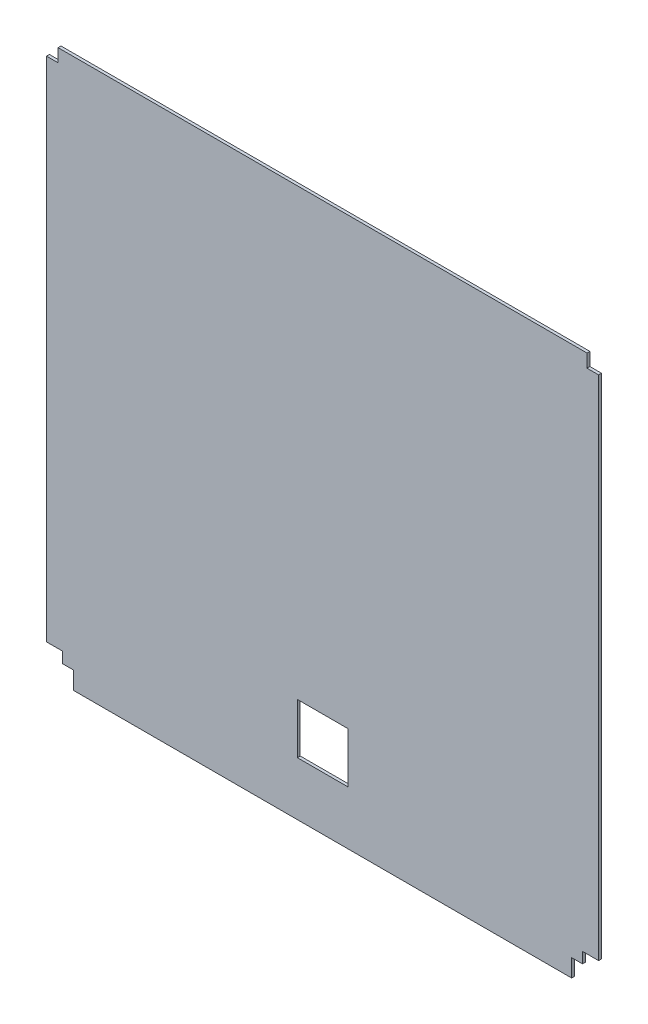
ISO-10303-21;
HEADER;
FILE_DESCRIPTION(('STEP AP214'),'2;1');
FILE_NAME('part.step','',(''),(''),'','','');
FILE_SCHEMA(('AUTOMOTIVE_DESIGN { 1 0 10303 214 1 1 1 1 }'));
ENDSEC;
DATA;
#1=APPLICATION_CONTEXT('core data for automotive mechanical design processes');
#2=APPLICATION_PROTOCOL_DEFINITION('international standard','automotive_design',2000,#1);
#3=PRODUCT_CONTEXT('',#1,'mechanical');
#4=PRODUCT('Part','Part','',(#3));
#5=PRODUCT_RELATED_PRODUCT_CATEGORY('part','',(#4));
#6=PRODUCT_DEFINITION_FORMATION('','',#4);
#7=PRODUCT_DEFINITION_CONTEXT('part definition',#1,'design');
#8=PRODUCT_DEFINITION('design','',#6,#7);
#9=PRODUCT_DEFINITION_SHAPE('','',#8);
#10=(LENGTH_UNIT() NAMED_UNIT(*) SI_UNIT(.MILLI.,.METRE.));
#11=(NAMED_UNIT(*) PLANE_ANGLE_UNIT() SI_UNIT($,.RADIAN.));
#12=(NAMED_UNIT(*) SI_UNIT($,.STERADIAN.) SOLID_ANGLE_UNIT());
#13=UNCERTAINTY_MEASURE_WITH_UNIT(LENGTH_MEASURE(1.E-05),#10,'distance_accuracy_value','');
#14=(GEOMETRIC_REPRESENTATION_CONTEXT(3) GLOBAL_UNCERTAINTY_ASSIGNED_CONTEXT((#13)) GLOBAL_UNIT_ASSIGNED_CONTEXT((#10,
#11,#12)) REPRESENTATION_CONTEXT('',''));
#15=CARTESIAN_POINT('',(0.,0.,0.));
#16=DIRECTION('',(0.,0.,1.));
#17=DIRECTION('',(1.,0.,0.));
#18=AXIS2_PLACEMENT_3D('',#15,#16,#17);
#19=CARTESIAN_POINT('',(0.,0.,0.));
#20=DIRECTION('',(0.,0.,1.));
#21=DIRECTION('',(1.,0.,0.));
#22=AXIS2_PLACEMENT_3D('',#19,#20,#21);
#23=PLANE('',#22);
#24=DIRECTION('',(0.,1.,0.));
#25=VECTOR('',#24,1.);
#26=CARTESIAN_POINT('',(27.8500000000025,-188.0575,0.));
#27=LINE('',#26,#25);
#28=CARTESIAN_POINT('',(27.8500000000025,-243.7575,0.));
#29=VERTEX_POINT('',#28);
#30=CARTESIAN_POINT('',(27.8500000000025,-188.0575,0.));
#31=VERTEX_POINT('',#30);
#32=EDGE_CURVE('E84',#29,#31,#27,.T.);
#33=ORIENTED_EDGE('',*,*,#32,.F.);
#34=DIRECTION('',(1.,0.,0.));
#35=VECTOR('',#34,1.);
#36=CARTESIAN_POINT('',(-27.8500000000025,-243.7575,0.));
#37=LINE('',#36,#35);
#38=CARTESIAN_POINT('',(-27.8500000000025,-243.7575,0.));
#39=VERTEX_POINT('',#38);
#40=EDGE_CURVE('E222',#39,#29,#37,.T.);
#41=ORIENTED_EDGE('',*,*,#40,.F.);
#42=DIRECTION('',(0.,-1.,0.));
#43=VECTOR('',#42,1.);
#44=CARTESIAN_POINT('',(-27.8500000000025,-188.0575,0.));
#45=LINE('',#44,#43);
#46=CARTESIAN_POINT('',(-27.8500000000025,-188.0575,0.));
#47=VERTEX_POINT('',#46);
#48=EDGE_CURVE('E225',#47,#39,#45,.T.);
#49=ORIENTED_EDGE('',*,*,#48,.F.);
#50=DIRECTION('',(-1.,0.,0.));
#51=VECTOR('',#50,1.);
#52=CARTESIAN_POINT('',(-27.8500000000025,-188.0575,0.));
#53=LINE('',#52,#51);
#54=EDGE_CURVE('E231',#31,#47,#53,.T.);
#55=ORIENTED_EDGE('',*,*,#54,.F.);
#56=EDGE_LOOP('',(#33,#41,#49,#55));
#57=FACE_BOUND('',#56,.T.);
#58=DIRECTION('',(1.,0.,0.));
#59=VECTOR('',#58,1.);
#60=CARTESIAN_POINT('',(-304.8,-303.0375,0.));
#61=LINE('',#60,#59);
#62=CARTESIAN_POINT('',(-274.950000000003,-303.0375,0.));
#63=VERTEX_POINT('',#62);
#64=CARTESIAN_POINT('',(274.950000000002,-303.0375,0.));
#65=VERTEX_POINT('',#64);
#66=EDGE_CURVE('E260',#63,#65,#61,.T.);
#67=ORIENTED_EDGE('',*,*,#66,.T.);
#68=DIRECTION('',(0.,1.,0.));
#69=VECTOR('',#68,1.);
#70=CARTESIAN_POINT('',(274.950000000001,9.87971313354263E-13,0.));
#71=LINE('',#70,#69);
#72=CARTESIAN_POINT('',(274.950000000002,-283.537499999998,3.47161535629859E-13));
#73=VERTEX_POINT('',#72);
#74=EDGE_CURVE('E266',#65,#73,#71,.T.);
#75=ORIENTED_EDGE('',*,*,#74,.T.);
#76=DIRECTION('',(-1.,0.,0.));
#77=VECTOR('',#76,1.);
#78=CARTESIAN_POINT('',(286.950000000002,-283.537499999998,3.4629417389187E-13));
#79=LINE('',#78,#77);
#80=CARTESIAN_POINT('',(286.950000000002,-283.537499999998,3.4629417389187E-13));
#81=VERTEX_POINT('',#80);
#82=EDGE_CURVE('E329',#81,#73,#79,.T.);
#83=ORIENTED_EDGE('',*,*,#82,.F.);
#84=DIRECTION('',(0.,1.,0.));
#85=VECTOR('',#84,1.);
#86=CARTESIAN_POINT('',(286.950000000002,-299.003077603944,2.36572914036337E-13));
#87=LINE('',#86,#85);
#88=CARTESIAN_POINT('',(286.950000000002,-271.537499999998,4.31512464649231E-13));
#89=VERTEX_POINT('',#88);
#90=EDGE_CURVE('E264',#81,#89,#87,.T.);
#91=ORIENTED_EDGE('',*,*,#90,.T.);
#92=DIRECTION('',(1.,0.,0.));
#93=VECTOR('',#92,1.);
#94=CARTESIAN_POINT('',(9.75708041920892E-13,-271.537499999999,0.));
#95=LINE('',#94,#93);
#96=CARTESIAN_POINT('',(304.8,-271.537499999998,0.));
#97=VERTEX_POINT('',#96);
#98=EDGE_CURVE('E269',#89,#97,#95,.T.);
#99=ORIENTED_EDGE('',*,*,#98,.T.);
#100=DIRECTION('',(0.,1.,0.));
#101=VECTOR('',#100,1.);
#102=CARTESIAN_POINT('',(304.8,303.0375,0.));
#103=LINE('',#102,#101);
#104=CARTESIAN_POINT('',(304.8,288.537500000004,0.));
#105=VERTEX_POINT('',#104);
#106=EDGE_CURVE('E271',#97,#105,#103,.T.);
#107=ORIENTED_EDGE('',*,*,#106,.T.);
#108=DIRECTION('',(1.,0.,0.));
#109=VECTOR('',#108,1.);
#110=CARTESIAN_POINT('',(2.92281912379367E-13,288.537500000004,0.));
#111=LINE('',#110,#109);
#112=CARTESIAN_POINT('',(291.949999998872,288.537500000004,0.));
#113=VERTEX_POINT('',#112);
#114=EDGE_CURVE('E297',#113,#105,#111,.T.);
#115=ORIENTED_EDGE('',*,*,#114,.F.);
#116=DIRECTION('',(0.,-1.,0.));
#117=VECTOR('',#116,1.);
#118=CARTESIAN_POINT('',(291.949999998872,1.4786934855751E-13,0.));
#119=LINE('',#118,#117);
#120=CARTESIAN_POINT('',(291.949999998872,303.0375,0.));
#121=VERTEX_POINT('',#120);
#122=EDGE_CURVE('E303',#121,#113,#119,.T.);
#123=ORIENTED_EDGE('',*,*,#122,.F.);
#124=DIRECTION('',(-1.,0.,0.));
#125=VECTOR('',#124,1.);
#126=CARTESIAN_POINT('',(-304.8,303.0375,0.));
#127=LINE('',#126,#125);
#128=CARTESIAN_POINT('',(-291.949999998866,303.0375,0.));
#129=VERTEX_POINT('',#128);
#130=EDGE_CURVE('E272',#121,#129,#127,.T.);
#131=ORIENTED_EDGE('',*,*,#130,.T.);
#132=DIRECTION('',(0.,1.,0.));
#133=VECTOR('',#132,1.);
#134=CARTESIAN_POINT('',(-291.949999998866,2.95738697115014E-13,0.));
#135=LINE('',#134,#133);
#136=CARTESIAN_POINT('',(-291.949999998866,288.537499997875,0.));
#137=VERTEX_POINT('',#136);
#138=EDGE_CURVE('E283',#137,#129,#135,.T.);
#139=ORIENTED_EDGE('',*,*,#138,.F.);
#140=DIRECTION('',(1.,0.,0.));
#141=VECTOR('',#140,1.);
#142=CARTESIAN_POINT('',(0.,288.537499997875,0.));
#143=LINE('',#142,#141);
#144=CARTESIAN_POINT('',(-304.8,288.537499997875,0.));
#145=VERTEX_POINT('',#144);
#146=EDGE_CURVE('E290',#145,#137,#143,.T.);
#147=ORIENTED_EDGE('',*,*,#146,.F.);
#148=DIRECTION('',(0.,-1.,0.));
#149=VECTOR('',#148,1.);
#150=CARTESIAN_POINT('',(-304.8,303.0375,0.));
#151=LINE('',#150,#149);
#152=CARTESIAN_POINT('',(-304.8,-271.5375,0.));
#153=VERTEX_POINT('',#152);
#154=EDGE_CURVE('E265',#145,#153,#151,.T.);
#155=ORIENTED_EDGE('',*,*,#154,.T.);
#156=DIRECTION('',(1.,0.,0.));
#157=VECTOR('',#156,1.);
#158=CARTESIAN_POINT('',(0.,-271.5375,0.));
#159=LINE('',#158,#157);
#160=CARTESIAN_POINT('',(-286.950000000003,-271.5375,-1.196959198424E-13));
#161=VERTEX_POINT('',#160);
#162=EDGE_CURVE('E261',#153,#161,#159,.T.);
#163=ORIENTED_EDGE('',*,*,#162,.T.);
#164=DIRECTION('',(0.,1.,0.));
#165=VECTOR('',#164,1.);
#166=CARTESIAN_POINT('',(-286.950000000003,-299.003077603946,-1.196959198424E-13));
#167=LINE('',#166,#165);
#168=CARTESIAN_POINT('',(-286.950000000003,-283.5375,-1.196959198424E-13));
#169=VERTEX_POINT('',#168);
#170=EDGE_CURVE('E316',#169,#161,#167,.T.);
#171=ORIENTED_EDGE('',*,*,#170,.F.);
#172=DIRECTION('',(-1.,0.,0.));
#173=VECTOR('',#172,1.);
#174=CARTESIAN_POINT('',(-286.950000000003,-283.5375,-1.196959198424E-13));
#175=LINE('',#174,#173);
#176=CARTESIAN_POINT('',(-274.950000000003,-283.5375,-1.196959198424E-13));
#177=VERTEX_POINT('',#176);
#178=EDGE_CURVE('E344',#177,#169,#175,.T.);
#179=ORIENTED_EDGE('',*,*,#178,.F.);
#180=DIRECTION('',(0.,-1.,0.));
#181=VECTOR('',#180,1.);
#182=CARTESIAN_POINT('',(-274.950000000003,0.,0.));
#183=LINE('',#182,#181);
#184=EDGE_CURVE('E244',#177,#63,#183,.T.);
#185=ORIENTED_EDGE('',*,*,#184,.T.);
#186=EDGE_LOOP('',(#67,#75,#83,#91,#99,#107,#115,#123,#131,#139,#147,#155,#163,#171,#179,#185));
#187=FACE_BOUND('',#186,.T.);
#188=ADVANCED_FACE('F67',(#57,#187),#23,.T.);
#189=CARTESIAN_POINT('',(304.8,303.0375,-3.175));
#190=DIRECTION('',(1.,0.,0.));
#191=DIRECTION('',(0.,1.,0.));
#192=AXIS2_PLACEMENT_3D('',#189,#190,#191);
#193=PLANE('',#192);
#194=ORIENTED_EDGE('',*,*,#106,.F.);
#195=DIRECTION('',(0.,0.,1.));
#196=VECTOR('',#195,1.);
#197=CARTESIAN_POINT('',(304.8,-271.537499999998,-3.175));
#198=LINE('',#197,#196);
#199=CARTESIAN_POINT('',(304.8,-271.537499999998,-3.175));
#200=VERTEX_POINT('',#199);
#201=EDGE_CURVE('E245',#200,#97,#198,.T.);
#202=ORIENTED_EDGE('',*,*,#201,.F.);
#203=DIRECTION('',(0.,1.,0.));
#204=VECTOR('',#203,1.);
#205=CARTESIAN_POINT('',(304.8,303.0375,-3.175));
#206=LINE('',#205,#204);
#207=CARTESIAN_POINT('',(304.8,288.537500000004,-3.175));
#208=VERTEX_POINT('',#207);
#209=EDGE_CURVE('E333',#200,#208,#206,.T.);
#210=ORIENTED_EDGE('',*,*,#209,.T.);
#211=DIRECTION('',(0.,0.,-1.));
#212=VECTOR('',#211,1.);
#213=CARTESIAN_POINT('',(304.8,288.537500000004,-3.175));
#214=LINE('',#213,#212);
#215=EDGE_CURVE('E293',#105,#208,#214,.T.);
#216=ORIENTED_EDGE('',*,*,#215,.F.);
#217=EDGE_LOOP('',(#194,#202,#210,#216));
#218=FACE_BOUND('',#217,.T.);
#219=ADVANCED_FACE('F414',(#218),#193,.T.);
#220=CARTESIAN_POINT('',(0.,0.,-3.175));
#221=DIRECTION('',(0.,0.,1.));
#222=DIRECTION('',(1.,0.,0.));
#223=AXIS2_PLACEMENT_3D('',#220,#221,#222);
#224=PLANE('',#223);
#225=DIRECTION('',(1.,0.,0.));
#226=VECTOR('',#225,1.);
#227=CARTESIAN_POINT('',(-27.8500000000025,-243.7575,-3.175));
#228=LINE('',#227,#226);
#229=CARTESIAN_POINT('',(-27.8500000000025,-243.7575,-3.175));
#230=VERTEX_POINT('',#229);
#231=CARTESIAN_POINT('',(27.8500000000025,-243.7575,-3.175));
#232=VERTEX_POINT('',#231);
#233=EDGE_CURVE('E213',#230,#232,#228,.T.);
#234=ORIENTED_EDGE('',*,*,#233,.T.);
#235=DIRECTION('',(0.,1.,0.));
#236=VECTOR('',#235,1.);
#237=CARTESIAN_POINT('',(27.8500000000025,-188.0575,-3.175));
#238=LINE('',#237,#236);
#239=CARTESIAN_POINT('',(27.8500000000025,-188.0575,-3.175));
#240=VERTEX_POINT('',#239);
#241=EDGE_CURVE('E207',#232,#240,#238,.T.);
#242=ORIENTED_EDGE('',*,*,#241,.T.);
#243=DIRECTION('',(-1.,0.,0.));
#244=VECTOR('',#243,1.);
#245=CARTESIAN_POINT('',(-27.8500000000025,-188.0575,-3.175));
#246=LINE('',#245,#244);
#247=CARTESIAN_POINT('',(-27.8500000000025,-188.0575,-3.175));
#248=VERTEX_POINT('',#247);
#249=EDGE_CURVE('E216',#240,#248,#246,.T.);
#250=ORIENTED_EDGE('',*,*,#249,.T.);
#251=DIRECTION('',(0.,-1.,0.));
#252=VECTOR('',#251,1.);
#253=CARTESIAN_POINT('',(-27.8500000000025,-188.0575,-3.175));
#254=LINE('',#253,#252);
#255=EDGE_CURVE('E92',#248,#230,#254,.T.);
#256=ORIENTED_EDGE('',*,*,#255,.T.);
#257=EDGE_LOOP('',(#234,#242,#250,#256));
#258=FACE_BOUND('',#257,.T.);
#259=DIRECTION('',(0.,1.,0.));
#260=VECTOR('',#259,1.);
#261=CARTESIAN_POINT('',(274.950000000001,9.87971313354263E-13,-3.175));
#262=LINE('',#261,#260);
#263=CARTESIAN_POINT('',(274.950000000002,-303.0375,-3.175));
#264=VERTEX_POINT('',#263);
#265=CARTESIAN_POINT('',(274.950000000002,-283.537499999998,-3.175));
#266=VERTEX_POINT('',#265);
#267=EDGE_CURVE('E12',#264,#266,#262,.T.);
#268=ORIENTED_EDGE('',*,*,#267,.F.);
#269=DIRECTION('',(1.,0.,0.));
#270=VECTOR('',#269,1.);
#271=CARTESIAN_POINT('',(-304.8,-303.0375,-3.175));
#272=LINE('',#271,#270);
#273=CARTESIAN_POINT('',(-274.950000000003,-303.0375,-3.175));
#274=VERTEX_POINT('',#273);
#275=EDGE_CURVE('E279',#274,#264,#272,.T.);
#276=ORIENTED_EDGE('',*,*,#275,.F.);
#277=DIRECTION('',(0.,-1.,0.));
#278=VECTOR('',#277,1.);
#279=CARTESIAN_POINT('',(-274.950000000003,0.,-3.175));
#280=LINE('',#279,#278);
#281=CARTESIAN_POINT('',(-274.950000000003,-283.5375,-3.175));
#282=VERTEX_POINT('',#281);
#283=EDGE_CURVE('E310',#282,#274,#280,.T.);
#284=ORIENTED_EDGE('',*,*,#283,.F.);
#285=DIRECTION('',(-1.,0.,0.));
#286=VECTOR('',#285,1.);
#287=CARTESIAN_POINT('',(0.,-283.5375,-3.175));
#288=LINE('',#287,#286);
#289=CARTESIAN_POINT('',(-286.950000000003,-283.5375,-3.175));
#290=VERTEX_POINT('',#289);
#291=EDGE_CURVE('E292',#282,#290,#288,.T.);
#292=ORIENTED_EDGE('',*,*,#291,.T.);
#293=DIRECTION('',(0.,-1.,0.));
#294=VECTOR('',#293,1.);
#295=CARTESIAN_POINT('',(-286.950000000003,0.,-3.175));
#296=LINE('',#295,#294);
#297=CARTESIAN_POINT('',(-286.950000000003,-271.5375,-3.175));
#298=VERTEX_POINT('',#297);
#299=EDGE_CURVE('E317',#298,#290,#296,.T.);
#300=ORIENTED_EDGE('',*,*,#299,.F.);
#301=DIRECTION('',(1.,0.,0.));
#302=VECTOR('',#301,1.);
#303=CARTESIAN_POINT('',(0.,-271.5375,-3.175));
#304=LINE('',#303,#302);
#305=CARTESIAN_POINT('',(-304.8,-271.5375,-3.175));
#306=VERTEX_POINT('',#305);
#307=EDGE_CURVE('E314',#306,#298,#304,.T.);
#308=ORIENTED_EDGE('',*,*,#307,.F.);
#309=DIRECTION('',(0.,-1.,0.));
#310=VECTOR('',#309,1.);
#311=CARTESIAN_POINT('',(-304.8,303.0375,-3.175));
#312=LINE('',#311,#310);
#313=CARTESIAN_POINT('',(-304.8,288.537499997875,-3.175));
#314=VERTEX_POINT('',#313);
#315=EDGE_CURVE('E71',#314,#306,#312,.T.);
#316=ORIENTED_EDGE('',*,*,#315,.F.);
#317=DIRECTION('',(1.,0.,0.));
#318=VECTOR('',#317,1.);
#319=CARTESIAN_POINT('',(0.,288.537499997875,-3.175));
#320=LINE('',#319,#318);
#321=CARTESIAN_POINT('',(-291.949999998866,288.537499997875,-3.175));
#322=VERTEX_POINT('',#321);
#323=EDGE_CURVE('E288',#314,#322,#320,.T.);
#324=ORIENTED_EDGE('',*,*,#323,.T.);
#325=DIRECTION('',(0.,1.,0.));
#326=VECTOR('',#325,1.);
#327=CARTESIAN_POINT('',(-291.949999998866,2.95738697115014E-13,-3.175));
#328=LINE('',#327,#326);
#329=CARTESIAN_POINT('',(-291.949999998866,303.0375,-3.175));
#330=VERTEX_POINT('',#329);
#331=EDGE_CURVE('E284',#322,#330,#328,.T.);
#332=ORIENTED_EDGE('',*,*,#331,.T.);
#333=DIRECTION('',(-1.,0.,0.));
#334=VECTOR('',#333,1.);
#335=CARTESIAN_POINT('',(-304.8,303.0375,-3.175));
#336=LINE('',#335,#334);
#337=CARTESIAN_POINT('',(291.949999998872,303.0375,-3.175));
#338=VERTEX_POINT('',#337);
#339=EDGE_CURVE('E275',#338,#330,#336,.T.);
#340=ORIENTED_EDGE('',*,*,#339,.F.);
#341=DIRECTION('',(0.,-1.,0.));
#342=VECTOR('',#341,1.);
#343=CARTESIAN_POINT('',(291.949999998872,1.4786934855751E-13,-3.175));
#344=LINE('',#343,#342);
#345=CARTESIAN_POINT('',(291.949999998872,288.537500000004,-3.175));
#346=VERTEX_POINT('',#345);
#347=EDGE_CURVE('E287',#338,#346,#344,.T.);
#348=ORIENTED_EDGE('',*,*,#347,.T.);
#349=DIRECTION('',(1.,0.,0.));
#350=VECTOR('',#349,1.);
#351=CARTESIAN_POINT('',(2.92281912379367E-13,288.537500000004,-3.175));
#352=LINE('',#351,#350);
#353=EDGE_CURVE('E298',#346,#208,#352,.T.);
#354=ORIENTED_EDGE('',*,*,#353,.T.);
#355=ORIENTED_EDGE('',*,*,#209,.F.);
#356=DIRECTION('',(1.,0.,0.));
#357=VECTOR('',#356,1.);
#358=CARTESIAN_POINT('',(9.75708041920892E-13,-271.537499999999,-3.175));
#359=LINE('',#358,#357);
#360=CARTESIAN_POINT('',(286.950000000002,-271.537499999998,-3.175));
#361=VERTEX_POINT('',#360);
#362=EDGE_CURVE('E322',#361,#200,#359,.T.);
#363=ORIENTED_EDGE('',*,*,#362,.F.);
#364=DIRECTION('',(0.,1.,0.));
#365=VECTOR('',#364,1.);
#366=CARTESIAN_POINT('',(286.950000000001,1.03109062872161E-12,-3.175));
#367=LINE('',#366,#365);
#368=CARTESIAN_POINT('',(286.950000000002,-283.537499999998,-3.175));
#369=VERTEX_POINT('',#368);
#370=EDGE_CURVE('E324',#369,#361,#367,.T.);
#371=ORIENTED_EDGE('',*,*,#370,.F.);
#372=DIRECTION('',(-1.,0.,0.));
#373=VECTOR('',#372,1.);
#374=CARTESIAN_POINT('',(1.01882730354424E-12,-283.537499999999,-3.175));
#375=LINE('',#374,#373);
#376=EDGE_CURVE('E301',#369,#266,#375,.T.);
#377=ORIENTED_EDGE('',*,*,#376,.T.);
#378=EDGE_LOOP('',(#268,#276,#284,#292,#300,#308,#316,#324,#332,#340,#348,#354,#355,#363,#371,#377));
#379=FACE_BOUND('',#378,.T.);
#380=ADVANCED_FACE('F69',(#258,#379),#224,.F.);
#381=CARTESIAN_POINT('',(-304.8,-303.0375,-3.175));
#382=DIRECTION('',(0.,-1.,0.));
#383=DIRECTION('',(0.,0.,-1.));
#384=AXIS2_PLACEMENT_3D('',#381,#382,#383);
#385=PLANE('',#384);
#386=DIRECTION('',(0.,0.,1.));
#387=VECTOR('',#386,1.);
#388=CARTESIAN_POINT('',(274.950000000002,-303.0375,-3.175));
#389=LINE('',#388,#387);
#390=EDGE_CURVE('E241',#264,#65,#389,.T.);
#391=ORIENTED_EDGE('',*,*,#390,.T.);
#392=ORIENTED_EDGE('',*,*,#66,.F.);
#393=DIRECTION('',(0.,0.,1.));
#394=VECTOR('',#393,1.);
#395=CARTESIAN_POINT('',(-274.950000000003,-303.0375,-3.175));
#396=LINE('',#395,#394);
#397=EDGE_CURVE('E254',#274,#63,#396,.T.);
#398=ORIENTED_EDGE('',*,*,#397,.F.);
#399=ORIENTED_EDGE('',*,*,#275,.T.);
#400=EDGE_LOOP('',(#391,#392,#398,#399));
#401=FACE_BOUND('',#400,.T.);
#402=ADVANCED_FACE('F357',(#401),#385,.T.);
#403=CARTESIAN_POINT('',(-304.8,303.0375,-3.175));
#404=DIRECTION('',(-1.,0.,0.));
#405=DIRECTION('',(0.,-1.,0.));
#406=AXIS2_PLACEMENT_3D('',#403,#404,#405);
#407=PLANE('',#406);
#408=DIRECTION('',(0.,0.,1.));
#409=VECTOR('',#408,1.);
#410=CARTESIAN_POINT('',(-304.8,-271.5375,-3.175));
#411=LINE('',#410,#409);
#412=EDGE_CURVE('E237',#306,#153,#411,.T.);
#413=ORIENTED_EDGE('',*,*,#412,.T.);
#414=ORIENTED_EDGE('',*,*,#154,.F.);
#415=DIRECTION('',(0.,0.,1.));
#416=VECTOR('',#415,1.);
#417=CARTESIAN_POINT('',(-304.8,288.537499997875,-3.175));
#418=LINE('',#417,#416);
#419=EDGE_CURVE('E278',#314,#145,#418,.T.);
#420=ORIENTED_EDGE('',*,*,#419,.F.);
#421=ORIENTED_EDGE('',*,*,#315,.T.);
#422=EDGE_LOOP('',(#413,#414,#420,#421));
#423=FACE_BOUND('',#422,.T.);
#424=ADVANCED_FACE('F387',(#423),#407,.T.);
#425=CARTESIAN_POINT('',(-304.8,303.0375,-3.175));
#426=DIRECTION('',(0.,1.,0.));
#427=DIRECTION('',(0.,0.,1.));
#428=AXIS2_PLACEMENT_3D('',#425,#426,#427);
#429=PLANE('',#428);
#430=DIRECTION('',(0.,0.,1.));
#431=VECTOR('',#430,1.);
#432=CARTESIAN_POINT('',(291.949999998872,303.0375,-3.175));
#433=LINE('',#432,#431);
#434=EDGE_CURVE('E282',#338,#121,#433,.T.);
#435=ORIENTED_EDGE('',*,*,#434,.F.);
#436=ORIENTED_EDGE('',*,*,#339,.T.);
#437=DIRECTION('',(0.,0.,-1.));
#438=VECTOR('',#437,1.);
#439=CARTESIAN_POINT('',(-291.949999998866,303.0375,-3.175));
#440=LINE('',#439,#438);
#441=EDGE_CURVE('E280',#129,#330,#440,.T.);
#442=ORIENTED_EDGE('',*,*,#441,.F.);
#443=ORIENTED_EDGE('',*,*,#130,.F.);
#444=EDGE_LOOP('',(#435,#436,#442,#443));
#445=FACE_BOUND('',#444,.T.);
#446=ADVANCED_FACE('F402',(#445),#429,.T.);
#447=CARTESIAN_POINT('',(-314.449999998866,288.537499997875,279.050000066034));
#448=DIRECTION('',(0.,-1.,0.));
#449=DIRECTION('',(1.,0.,0.));
#450=AXIS2_PLACEMENT_3D('',#447,#448,#449);
#451=PLANE('',#450);
#452=ORIENTED_EDGE('',*,*,#419,.T.);
#453=ORIENTED_EDGE('',*,*,#146,.T.);
#454=DIRECTION('',(0.,0.,1.));
#455=VECTOR('',#454,1.);
#456=CARTESIAN_POINT('',(-291.949999998866,288.537499997875,-3.175));
#457=LINE('',#456,#455);
#458=EDGE_CURVE('E251',#322,#137,#457,.T.);
#459=ORIENTED_EDGE('',*,*,#458,.F.);
#460=ORIENTED_EDGE('',*,*,#323,.F.);
#461=EDGE_LOOP('',(#452,#453,#459,#460));
#462=FACE_BOUND('',#461,.T.);
#463=ADVANCED_FACE('F395',(#462),#451,.F.);
#464=CARTESIAN_POINT('',(-291.949999998866,311.037499997875,279.050000066034));
#465=DIRECTION('',(1.,0.,0.));
#466=DIRECTION('',(0.,1.,0.));
#467=AXIS2_PLACEMENT_3D('',#464,#465,#466);
#468=PLANE('',#467);
#469=ORIENTED_EDGE('',*,*,#331,.F.);
#470=ORIENTED_EDGE('',*,*,#458,.T.);
#471=ORIENTED_EDGE('',*,*,#138,.T.);
#472=ORIENTED_EDGE('',*,*,#441,.T.);
#473=EDGE_LOOP('',(#469,#470,#471,#472));
#474=FACE_BOUND('',#473,.T.);
#475=ADVANCED_FACE('F393',(#474),#468,.F.);
#476=CARTESIAN_POINT('',(291.949999998872,311.037500000004,279.050000066034));
#477=DIRECTION('',(-1.,0.,0.));
#478=DIRECTION('',(0.,-1.,0.));
#479=AXIS2_PLACEMENT_3D('',#476,#477,#478);
#480=PLANE('',#479);
#481=ORIENTED_EDGE('',*,*,#434,.T.);
#482=ORIENTED_EDGE('',*,*,#122,.T.);
#483=DIRECTION('',(0.,0.,1.));
#484=VECTOR('',#483,1.);
#485=CARTESIAN_POINT('',(291.949999998872,288.537500000004,-3.175));
#486=LINE('',#485,#484);
#487=EDGE_CURVE('E248',#346,#113,#486,.T.);
#488=ORIENTED_EDGE('',*,*,#487,.F.);
#489=ORIENTED_EDGE('',*,*,#347,.F.);
#490=EDGE_LOOP('',(#481,#482,#488,#489));
#491=FACE_BOUND('',#490,.T.);
#492=ADVANCED_FACE('F410',(#491),#480,.F.);
#493=CARTESIAN_POINT('',(314.449999998872,288.537500000004,279.050000066034));
#494=DIRECTION('',(0.,-1.,0.));
#495=DIRECTION('',(1.,0.,0.));
#496=AXIS2_PLACEMENT_3D('',#493,#494,#495);
#497=PLANE('',#496);
#498=ORIENTED_EDGE('',*,*,#353,.F.);
#499=ORIENTED_EDGE('',*,*,#487,.T.);
#500=ORIENTED_EDGE('',*,*,#114,.T.);
#501=ORIENTED_EDGE('',*,*,#215,.T.);
#502=EDGE_LOOP('',(#498,#499,#500,#501));
#503=FACE_BOUND('',#502,.T.);
#504=ADVANCED_FACE('F408',(#503),#497,.F.);
#505=CARTESIAN_POINT('',(-289.950000000003,-283.5375,3.31249999999988));
#506=DIRECTION('',(0.,1.,0.));
#507=DIRECTION('',(0.,0.,1.));
#508=AXIS2_PLACEMENT_3D('',#505,#506,#507);
#509=PLANE('',#508);
#510=DIRECTION('',(0.,0.,1.));
#511=VECTOR('',#510,1.);
#512=CARTESIAN_POINT('',(-274.950000000003,-283.5375,-1.196959198424E-13));
#513=LINE('',#512,#511);
#514=EDGE_CURVE('E296',#282,#177,#513,.T.);
#515=ORIENTED_EDGE('',*,*,#514,.T.);
#516=ORIENTED_EDGE('',*,*,#178,.T.);
#517=DIRECTION('',(0.,0.,-1.));
#518=VECTOR('',#517,1.);
#519=CARTESIAN_POINT('',(-286.950000000003,-283.5375,-1.196959198424E-13));
#520=LINE('',#519,#518);
#521=EDGE_CURVE('E319',#169,#290,#520,.T.);
#522=ORIENTED_EDGE('',*,*,#521,.T.);
#523=ORIENTED_EDGE('',*,*,#291,.F.);
#524=EDGE_LOOP('',(#515,#516,#522,#523));
#525=FACE_BOUND('',#524,.T.);
#526=ADVANCED_FACE('F373',(#525),#509,.F.);
#527=CARTESIAN_POINT('',(-286.950000000003,-299.003077603946,-1.196959198424E-13));
#528=DIRECTION('',(-1.,0.,0.));
#529=DIRECTION('',(0.,0.,1.));
#530=AXIS2_PLACEMENT_3D('',#527,#528,#529);
#531=PLANE('',#530);
#532=ORIENTED_EDGE('',*,*,#299,.T.);
#533=ORIENTED_EDGE('',*,*,#521,.F.);
#534=ORIENTED_EDGE('',*,*,#170,.T.);
#535=DIRECTION('',(0.,0.,1.));
#536=VECTOR('',#535,1.);
#537=CARTESIAN_POINT('',(-286.950000000003,-271.5375,-1.196959198424E-13));
#538=LINE('',#537,#536);
#539=EDGE_CURVE('E313',#298,#161,#538,.T.);
#540=ORIENTED_EDGE('',*,*,#539,.F.);
#541=EDGE_LOOP('',(#532,#533,#534,#540));
#542=FACE_BOUND('',#541,.T.);
#543=ADVANCED_FACE('F380',(#542),#531,.T.);
#544=CARTESIAN_POINT('',(-289.950000000003,-271.5375,3.31249999999988));
#545=DIRECTION('',(0.,-1.,0.));
#546=DIRECTION('',(0.,0.,-1.));
#547=AXIS2_PLACEMENT_3D('',#544,#545,#546);
#548=PLANE('',#547);
#549=ORIENTED_EDGE('',*,*,#307,.T.);
#550=ORIENTED_EDGE('',*,*,#539,.T.);
#551=ORIENTED_EDGE('',*,*,#162,.F.);
#552=ORIENTED_EDGE('',*,*,#412,.F.);
#553=EDGE_LOOP('',(#549,#550,#551,#552));
#554=FACE_BOUND('',#553,.T.);
#555=ADVANCED_FACE('F382',(#554),#548,.T.);
#556=CARTESIAN_POINT('',(-274.950000000003,-286.5375,3.31249999999988));
#557=DIRECTION('',(-1.,0.,0.));
#558=DIRECTION('',(0.,0.,1.));
#559=AXIS2_PLACEMENT_3D('',#556,#557,#558);
#560=PLANE('',#559);
#561=ORIENTED_EDGE('',*,*,#283,.T.);
#562=ORIENTED_EDGE('',*,*,#397,.T.);
#563=ORIENTED_EDGE('',*,*,#184,.F.);
#564=ORIENTED_EDGE('',*,*,#514,.F.);
#565=EDGE_LOOP('',(#561,#562,#563,#564));
#566=FACE_BOUND('',#565,.T.);
#567=ADVANCED_FACE('F371',(#566),#560,.T.);
#568=CARTESIAN_POINT('',(289.950000000002,-283.537499999998,-6.68749999999965));
#569=DIRECTION('',(0.,1.,0.));
#570=DIRECTION('',(0.,0.,-1.));
#571=AXIS2_PLACEMENT_3D('',#568,#569,#570);
#572=PLANE('',#571);
#573=DIRECTION('',(0.,0.,1.));
#574=VECTOR('',#573,1.);
#575=CARTESIAN_POINT('',(286.950000000002,-283.537499999998,-3.37499999999965));
#576=LINE('',#575,#574);
#577=EDGE_CURVE('E312',#369,#81,#576,.T.);
#578=ORIENTED_EDGE('',*,*,#577,.T.);
#579=ORIENTED_EDGE('',*,*,#82,.T.);
#580=DIRECTION('',(0.,0.,-1.));
#581=VECTOR('',#580,1.);
#582=CARTESIAN_POINT('',(274.950000000002,-283.537499999998,-3.37499999999965));
#583=LINE('',#582,#581);
#584=EDGE_CURVE('E326',#73,#266,#583,.T.);
#585=ORIENTED_EDGE('',*,*,#584,.T.);
#586=ORIENTED_EDGE('',*,*,#376,.F.);
#587=EDGE_LOOP('',(#578,#579,#585,#586));
#588=FACE_BOUND('',#587,.T.);
#589=ADVANCED_FACE('F425',(#588),#572,.F.);
#590=CARTESIAN_POINT('',(286.950000000002,-299.003077603944,-3.37499999999976));
#591=DIRECTION('',(1.,0.,0.));
#592=DIRECTION('',(0.,0.,-1.));
#593=AXIS2_PLACEMENT_3D('',#590,#591,#592);
#594=PLANE('',#593);
#595=ORIENTED_EDGE('',*,*,#370,.T.);
#596=DIRECTION('',(0.,0.,-1.));
#597=VECTOR('',#596,1.);
#598=CARTESIAN_POINT('',(286.950000000002,-271.537499999998,-3.37499999999957));
#599=LINE('',#598,#597);
#600=EDGE_CURVE('E76',#89,#361,#599,.T.);
#601=ORIENTED_EDGE('',*,*,#600,.F.);
#602=ORIENTED_EDGE('',*,*,#90,.F.);
#603=ORIENTED_EDGE('',*,*,#577,.F.);
#604=EDGE_LOOP('',(#595,#601,#602,#603));
#605=FACE_BOUND('',#604,.T.);
#606=ADVANCED_FACE('F422',(#605),#594,.T.);
#607=CARTESIAN_POINT('',(289.950000000002,-271.537499999998,-6.68749999999957));
#608=DIRECTION('',(0.,-1.,0.));
#609=DIRECTION('',(0.,0.,1.));
#610=AXIS2_PLACEMENT_3D('',#607,#608,#609);
#611=PLANE('',#610);
#612=ORIENTED_EDGE('',*,*,#362,.T.);
#613=ORIENTED_EDGE('',*,*,#201,.T.);
#614=ORIENTED_EDGE('',*,*,#98,.F.);
#615=ORIENTED_EDGE('',*,*,#600,.T.);
#616=EDGE_LOOP('',(#612,#613,#614,#615));
#617=FACE_BOUND('',#616,.T.);
#618=ADVANCED_FACE('F418',(#617),#611,.T.);
#619=CARTESIAN_POINT('',(274.950000000002,-286.537499999998,-6.68749999999967));
#620=DIRECTION('',(1.,0.,0.));
#621=DIRECTION('',(0.,0.,-1.));
#622=AXIS2_PLACEMENT_3D('',#619,#620,#621);
#623=PLANE('',#622);
#624=ORIENTED_EDGE('',*,*,#267,.T.);
#625=ORIENTED_EDGE('',*,*,#584,.F.);
#626=ORIENTED_EDGE('',*,*,#74,.F.);
#627=ORIENTED_EDGE('',*,*,#390,.F.);
#628=EDGE_LOOP('',(#624,#625,#626,#627));
#629=FACE_BOUND('',#628,.T.);
#630=ADVANCED_FACE('F364',(#629),#623,.T.);
#631=CARTESIAN_POINT('',(27.8500000000025,-188.0575,-3.175));
#632=DIRECTION('',(1.,0.,0.));
#633=DIRECTION('',(0.,1.,0.));
#634=AXIS2_PLACEMENT_3D('',#631,#632,#633);
#635=PLANE('',#634);
#636=ORIENTED_EDGE('',*,*,#32,.T.);
#637=DIRECTION('',(0.,0.,1.));
#638=VECTOR('',#637,1.);
#639=CARTESIAN_POINT('',(27.8500000000025,-188.0575,-3.175));
#640=LINE('',#639,#638);
#641=EDGE_CURVE('E203',#240,#31,#640,.T.);
#642=ORIENTED_EDGE('',*,*,#641,.F.);
#643=ORIENTED_EDGE('',*,*,#241,.F.);
#644=DIRECTION('',(0.,0.,1.));
#645=VECTOR('',#644,1.);
#646=CARTESIAN_POINT('',(27.8500000000025,-243.7575,-3.175));
#647=LINE('',#646,#645);
#648=EDGE_CURVE('E235',#232,#29,#647,.T.);
#649=ORIENTED_EDGE('',*,*,#648,.T.);
#650=EDGE_LOOP('',(#636,#642,#643,#649));
#651=FACE_BOUND('',#650,.T.);
#652=ADVANCED_FACE('F205',(#651),#635,.F.);
#653=CARTESIAN_POINT('',(-27.8500000000025,-243.7575,-3.175));
#654=DIRECTION('',(0.,-1.,0.));
#655=DIRECTION('',(0.,0.,-1.));
#656=AXIS2_PLACEMENT_3D('',#653,#654,#655);
#657=PLANE('',#656);
#658=ORIENTED_EDGE('',*,*,#40,.T.);
#659=ORIENTED_EDGE('',*,*,#648,.F.);
#660=ORIENTED_EDGE('',*,*,#233,.F.);
#661=DIRECTION('',(0.,0.,1.));
#662=VECTOR('',#661,1.);
#663=CARTESIAN_POINT('',(-27.8500000000025,-243.7575,-3.175));
#664=LINE('',#663,#662);
#665=EDGE_CURVE('E238',#230,#39,#664,.T.);
#666=ORIENTED_EDGE('',*,*,#665,.T.);
#667=EDGE_LOOP('',(#658,#659,#660,#666));
#668=FACE_BOUND('',#667,.T.);
#669=ADVANCED_FACE('F489',(#668),#657,.F.);
#670=CARTESIAN_POINT('',(-27.8500000000025,-188.0575,-3.175));
#671=DIRECTION('',(-1.,0.,0.));
#672=DIRECTION('',(0.,0.,1.));
#673=AXIS2_PLACEMENT_3D('',#670,#671,#672);
#674=PLANE('',#673);
#675=ORIENTED_EDGE('',*,*,#48,.T.);
#676=ORIENTED_EDGE('',*,*,#665,.F.);
#677=ORIENTED_EDGE('',*,*,#255,.F.);
#678=DIRECTION('',(0.,0.,1.));
#679=VECTOR('',#678,1.);
#680=CARTESIAN_POINT('',(-27.8500000000025,-188.0575,-3.175));
#681=LINE('',#680,#679);
#682=EDGE_CURVE('E212',#248,#47,#681,.T.);
#683=ORIENTED_EDGE('',*,*,#682,.T.);
#684=EDGE_LOOP('',(#675,#676,#677,#683));
#685=FACE_BOUND('',#684,.T.);
#686=ADVANCED_FACE('F499',(#685),#674,.F.);
#687=CARTESIAN_POINT('',(-27.8500000000025,-188.0575,-3.175));
#688=DIRECTION('',(0.,1.,0.));
#689=DIRECTION('',(0.,0.,1.));
#690=AXIS2_PLACEMENT_3D('',#687,#688,#689);
#691=PLANE('',#690);
#692=ORIENTED_EDGE('',*,*,#54,.T.);
#693=ORIENTED_EDGE('',*,*,#682,.F.);
#694=ORIENTED_EDGE('',*,*,#249,.F.);
#695=ORIENTED_EDGE('',*,*,#641,.T.);
#696=EDGE_LOOP('',(#692,#693,#694,#695));
#697=FACE_BOUND('',#696,.T.);
#698=ADVANCED_FACE('F217',(#697),#691,.F.);
#699=CLOSED_SHELL('',(#188,#219,#380,#402,#424,#446,#463,#475,#492,#504,#526,#543,#555,#567,
#589,#606,#618,#630,#652,#669,#686,#698));
#700=MANIFOLD_SOLID_BREP('B2',#699);
#701=ADVANCED_BREP_SHAPE_REPRESENTATION('',(#18,#700),#14);
#702=SHAPE_DEFINITION_REPRESENTATION(#9,#701);
ENDSEC;
END-ISO-10303-21;
